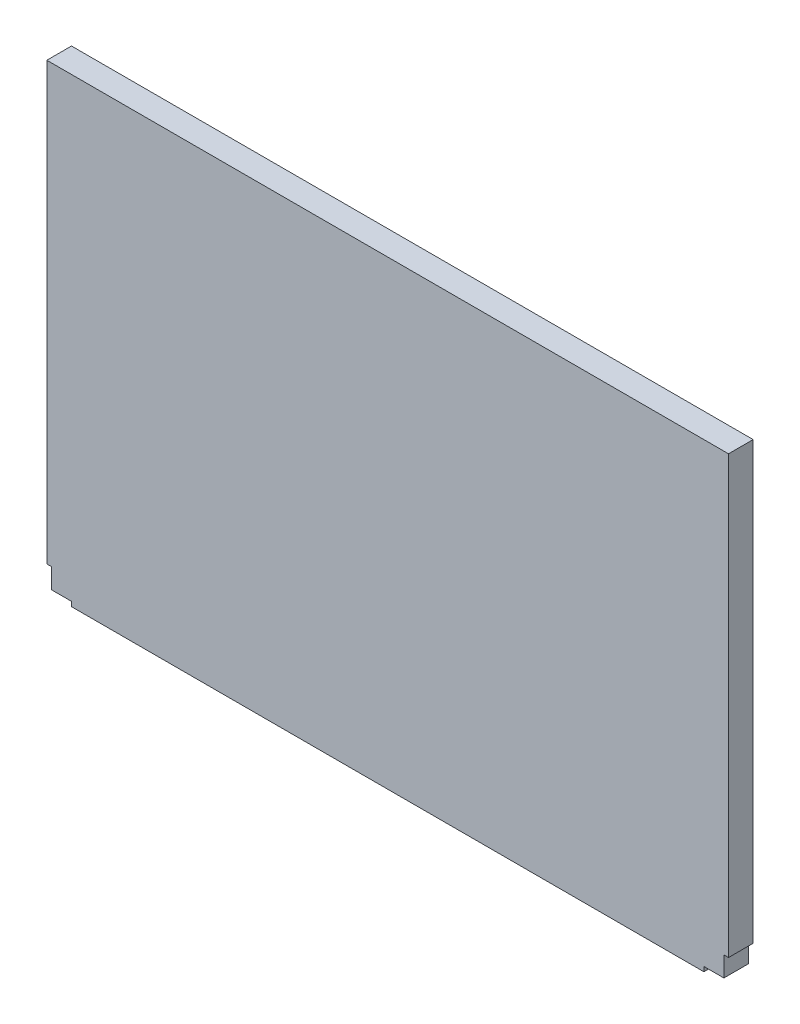
ISO-10303-21;
HEADER;
FILE_DESCRIPTION(('STEP AP214'),'2;1');
FILE_NAME('part.step','',(''),(''),'','','');
FILE_SCHEMA(('AUTOMOTIVE_DESIGN { 1 0 10303 214 1 1 1 1 }'));
ENDSEC;
DATA;
#1=APPLICATION_CONTEXT('core data for automotive mechanical design processes');
#2=APPLICATION_PROTOCOL_DEFINITION('international standard','automotive_design',2000,#1);
#3=PRODUCT_CONTEXT('',#1,'mechanical');
#4=PRODUCT('Part','Part','',(#3));
#5=PRODUCT_RELATED_PRODUCT_CATEGORY('part','',(#4));
#6=PRODUCT_DEFINITION_FORMATION('','',#4);
#7=PRODUCT_DEFINITION_CONTEXT('part definition',#1,'design');
#8=PRODUCT_DEFINITION('design','',#6,#7);
#9=PRODUCT_DEFINITION_SHAPE('','',#8);
#10=(LENGTH_UNIT() NAMED_UNIT(*) SI_UNIT(.MILLI.,.METRE.));
#11=(NAMED_UNIT(*) PLANE_ANGLE_UNIT() SI_UNIT($,.RADIAN.));
#12=(NAMED_UNIT(*) SI_UNIT($,.STERADIAN.) SOLID_ANGLE_UNIT());
#13=UNCERTAINTY_MEASURE_WITH_UNIT(LENGTH_MEASURE(1.E-05),#10,'distance_accuracy_value','');
#14=(GEOMETRIC_REPRESENTATION_CONTEXT(3) GLOBAL_UNCERTAINTY_ASSIGNED_CONTEXT((#13)) GLOBAL_UNIT_ASSIGNED_CONTEXT((#10,
#11,#12)) REPRESENTATION_CONTEXT('',''));
#15=CARTESIAN_POINT('',(0.,0.,0.));
#16=DIRECTION('',(0.,0.,1.));
#17=DIRECTION('',(1.,0.,0.));
#18=AXIS2_PLACEMENT_3D('',#15,#16,#17);
#19=CARTESIAN_POINT('',(0.,0.,50.8));
#20=DIRECTION('',(1.,0.,0.));
#21=DIRECTION('',(0.,1.,0.));
#22=AXIS2_PLACEMENT_3D('',#19,#20,#21);
#23=PLANE('',#22);
#24=DIRECTION('',(0.,-1.,0.));
#25=VECTOR('',#24,1.);
#26=CARTESIAN_POINT('',(0.,0.,0.));
#27=LINE('',#26,#25);
#28=CARTESIAN_POINT('',(0.,0.,0.));
#29=VERTEX_POINT('',#28);
#30=CARTESIAN_POINT('',(0.,-899.2,0.));
#31=VERTEX_POINT('',#30);
#32=EDGE_CURVE('E156',#29,#31,#27,.T.);
#33=ORIENTED_EDGE('',*,*,#32,.T.);
#34=DIRECTION('',(0.,0.,1.));
#35=VECTOR('',#34,1.);
#36=CARTESIAN_POINT('',(0.,-899.2,-0.199999999999999));
#37=LINE('',#36,#35);
#38=CARTESIAN_POINT('',(0.,-899.2,50.8));
#39=VERTEX_POINT('',#38);
#40=EDGE_CURVE('E160',#31,#39,#37,.T.);
#41=ORIENTED_EDGE('',*,*,#40,.T.);
#42=DIRECTION('',(0.,-1.,0.));
#43=VECTOR('',#42,1.);
#44=CARTESIAN_POINT('',(0.,0.,50.8));
#45=LINE('',#44,#43);
#46=CARTESIAN_POINT('',(0.,0.,50.8));
#47=VERTEX_POINT('',#46);
#48=EDGE_CURVE('E152',#47,#39,#45,.T.);
#49=ORIENTED_EDGE('',*,*,#48,.F.);
#50=DIRECTION('',(0.,0.,-1.));
#51=VECTOR('',#50,1.);
#52=CARTESIAN_POINT('',(0.,0.,50.8));
#53=LINE('',#52,#51);
#54=EDGE_CURVE('E149',#47,#29,#53,.T.);
#55=ORIENTED_EDGE('',*,*,#54,.T.);
#56=EDGE_LOOP('',(#33,#41,#49,#55));
#57=FACE_BOUND('',#56,.T.);
#58=ADVANCED_FACE('F35',(#57),#23,.F.);
#59=CARTESIAN_POINT('',(1.16341445918999E-13,-950.,50.8));
#60=DIRECTION('',(0.,1.,0.));
#61=DIRECTION('',(0.,0.,1.));
#62=AXIS2_PLACEMENT_3D('',#59,#60,#61);
#63=PLANE('',#62);
#64=DIRECTION('',(1.,0.,0.));
#65=VECTOR('',#64,1.);
#66=CARTESIAN_POINT('',(1.16341445918999E-13,-950.,0.));
#67=LINE('',#66,#65);
#68=CARTESIAN_POINT('',(50.8000000000001,-950.,0.));
#69=VERTEX_POINT('',#68);
#70=CARTESIAN_POINT('',(1354.2,-950.,0.));
#71=VERTEX_POINT('',#70);
#72=EDGE_CURVE('E159',#69,#71,#67,.T.);
#73=ORIENTED_EDGE('',*,*,#72,.T.);
#74=DIRECTION('',(0.,0.,1.));
#75=VECTOR('',#74,1.);
#76=CARTESIAN_POINT('',(1354.2,-950.,-0.199999999999999));
#77=LINE('',#76,#75);
#78=CARTESIAN_POINT('',(1354.2,-950.,50.8));
#79=VERTEX_POINT('',#78);
#80=EDGE_CURVE('E199',#71,#79,#77,.T.);
#81=ORIENTED_EDGE('',*,*,#80,.T.);
#82=DIRECTION('',(1.,0.,0.));
#83=VECTOR('',#82,1.);
#84=CARTESIAN_POINT('',(1.16341445918999E-13,-950.,50.8));
#85=LINE('',#84,#83);
#86=CARTESIAN_POINT('',(50.8000000000001,-950.,50.8));
#87=VERTEX_POINT('',#86);
#88=EDGE_CURVE('E147',#87,#79,#85,.T.);
#89=ORIENTED_EDGE('',*,*,#88,.F.);
#90=DIRECTION('',(0.,0.,1.));
#91=VECTOR('',#90,1.);
#92=CARTESIAN_POINT('',(50.8000000000001,-950.,-0.199999999999999));
#93=LINE('',#92,#91);
#94=EDGE_CURVE('E214',#69,#87,#93,.T.);
#95=ORIENTED_EDGE('',*,*,#94,.F.);
#96=EDGE_LOOP('',(#73,#81,#89,#95));
#97=FACE_BOUND('',#96,.T.);
#98=ADVANCED_FACE('F244',(#97),#63,.F.);
#99=CARTESIAN_POINT('',(1405.,0.,50.8));
#100=DIRECTION('',(-1.,0.,0.));
#101=DIRECTION('',(0.,-1.,0.));
#102=AXIS2_PLACEMENT_3D('',#99,#100,#101);
#103=PLANE('',#102);
#104=DIRECTION('',(0.,1.,0.));
#105=VECTOR('',#104,1.);
#106=CARTESIAN_POINT('',(1405.,0.,50.8));
#107=LINE('',#106,#105);
#108=CARTESIAN_POINT('',(1405.,-899.2,50.8));
#109=VERTEX_POINT('',#108);
#110=CARTESIAN_POINT('',(1405.,0.,50.8));
#111=VERTEX_POINT('',#110);
#112=EDGE_CURVE('E136',#109,#111,#107,.T.);
#113=ORIENTED_EDGE('',*,*,#112,.F.);
#114=DIRECTION('',(0.,0.,1.));
#115=VECTOR('',#114,1.);
#116=CARTESIAN_POINT('',(1405.,-899.2,-0.199999999999999));
#117=LINE('',#116,#115);
#118=CARTESIAN_POINT('',(1405.,-899.2,0.));
#119=VERTEX_POINT('',#118);
#120=EDGE_CURVE('E121',#119,#109,#117,.T.);
#121=ORIENTED_EDGE('',*,*,#120,.F.);
#122=DIRECTION('',(0.,1.,0.));
#123=VECTOR('',#122,1.);
#124=CARTESIAN_POINT('',(1405.,0.,0.));
#125=LINE('',#124,#123);
#126=CARTESIAN_POINT('',(1405.,0.,0.));
#127=VERTEX_POINT('',#126);
#128=EDGE_CURVE('E163',#119,#127,#125,.T.);
#129=ORIENTED_EDGE('',*,*,#128,.T.);
#130=DIRECTION('',(0.,0.,-1.));
#131=VECTOR('',#130,1.);
#132=CARTESIAN_POINT('',(1405.,0.,50.8));
#133=LINE('',#132,#131);
#134=EDGE_CURVE('E144',#111,#127,#133,.T.);
#135=ORIENTED_EDGE('',*,*,#134,.F.);
#136=EDGE_LOOP('',(#113,#121,#129,#135));
#137=FACE_BOUND('',#136,.T.);
#138=ADVANCED_FACE('F142',(#137),#103,.F.);
#139=CARTESIAN_POINT('',(0.,0.,50.8));
#140=DIRECTION('',(0.,-1.,0.));
#141=DIRECTION('',(0.,0.,-1.));
#142=AXIS2_PLACEMENT_3D('',#139,#140,#141);
#143=PLANE('',#142);
#144=DIRECTION('',(-1.,0.,0.));
#145=VECTOR('',#144,1.);
#146=CARTESIAN_POINT('',(0.,0.,0.));
#147=LINE('',#146,#145);
#148=EDGE_CURVE('E165',#127,#29,#147,.T.);
#149=ORIENTED_EDGE('',*,*,#148,.T.);
#150=ORIENTED_EDGE('',*,*,#54,.F.);
#151=DIRECTION('',(-1.,0.,0.));
#152=VECTOR('',#151,1.);
#153=CARTESIAN_POINT('',(0.,0.,50.8));
#154=LINE('',#153,#152);
#155=EDGE_CURVE('E146',#111,#47,#154,.T.);
#156=ORIENTED_EDGE('',*,*,#155,.F.);
#157=ORIENTED_EDGE('',*,*,#134,.T.);
#158=EDGE_LOOP('',(#149,#150,#156,#157));
#159=FACE_BOUND('',#158,.T.);
#160=ADVANCED_FACE('F267',(#159),#143,.F.);
#161=CARTESIAN_POINT('',(0.,0.,50.8));
#162=DIRECTION('',(0.,0.,1.));
#163=DIRECTION('',(1.,0.,0.));
#164=AXIS2_PLACEMENT_3D('',#161,#162,#163);
#165=PLANE('',#164);
#166=DIRECTION('',(0.,-1.,0.));
#167=VECTOR('',#166,1.);
#168=CARTESIAN_POINT('',(1354.2,-940.475,50.8));
#169=LINE('',#168,#167);
#170=CARTESIAN_POINT('',(1354.2,-940.475,50.8));
#171=VERTEX_POINT('',#170);
#172=EDGE_CURVE('E131',#171,#79,#169,.T.);
#173=ORIENTED_EDGE('',*,*,#172,.F.);
#174=DIRECTION('',(-1.,0.,0.));
#175=VECTOR('',#174,1.);
#176=CARTESIAN_POINT('',(1395.475,-940.475,50.8));
#177=LINE('',#176,#175);
#178=CARTESIAN_POINT('',(1395.475,-940.475,50.8));
#179=VERTEX_POINT('',#178);
#180=EDGE_CURVE('E248',#179,#171,#177,.T.);
#181=ORIENTED_EDGE('',*,*,#180,.F.);
#182=DIRECTION('',(0.,-1.,0.));
#183=VECTOR('',#182,1.);
#184=CARTESIAN_POINT('',(1395.475,-899.2,50.8));
#185=LINE('',#184,#183);
#186=CARTESIAN_POINT('',(1395.475,-899.2,50.8));
#187=VERTEX_POINT('',#186);
#188=EDGE_CURVE('E140',#187,#179,#185,.T.);
#189=ORIENTED_EDGE('',*,*,#188,.F.);
#190=DIRECTION('',(-1.,0.,0.));
#191=VECTOR('',#190,1.);
#192=CARTESIAN_POINT('',(1405.,-899.2,50.8));
#193=LINE('',#192,#191);
#194=EDGE_CURVE('E124',#109,#187,#193,.T.);
#195=ORIENTED_EDGE('',*,*,#194,.F.);
#196=ORIENTED_EDGE('',*,*,#112,.T.);
#197=ORIENTED_EDGE('',*,*,#155,.T.);
#198=ORIENTED_EDGE('',*,*,#48,.T.);
#199=DIRECTION('',(-1.,0.,0.));
#200=VECTOR('',#199,1.);
#201=CARTESIAN_POINT('',(0.,-899.2,50.8));
#202=LINE('',#201,#200);
#203=CARTESIAN_POINT('',(9.525,-899.2,50.8));
#204=VERTEX_POINT('',#203);
#205=EDGE_CURVE('E212',#204,#39,#202,.T.);
#206=ORIENTED_EDGE('',*,*,#205,.F.);
#207=DIRECTION('',(0.,1.,0.));
#208=VECTOR('',#207,1.);
#209=CARTESIAN_POINT('',(9.525,-899.2,50.8));
#210=LINE('',#209,#208);
#211=CARTESIAN_POINT('',(9.52500000000001,-940.475,50.8));
#212=VERTEX_POINT('',#211);
#213=EDGE_CURVE('E209',#212,#204,#210,.T.);
#214=ORIENTED_EDGE('',*,*,#213,.F.);
#215=DIRECTION('',(-1.,0.,0.));
#216=VECTOR('',#215,1.);
#217=CARTESIAN_POINT('',(9.52500000000001,-940.475,50.8));
#218=LINE('',#217,#216);
#219=CARTESIAN_POINT('',(50.8000000000001,-940.475,50.8));
#220=VERTEX_POINT('',#219);
#221=EDGE_CURVE('E206',#220,#212,#218,.T.);
#222=ORIENTED_EDGE('',*,*,#221,.F.);
#223=DIRECTION('',(0.,1.,0.));
#224=VECTOR('',#223,1.);
#225=CARTESIAN_POINT('',(50.8000000000001,-940.475,50.8));
#226=LINE('',#225,#224);
#227=EDGE_CURVE('E204',#87,#220,#226,.T.);
#228=ORIENTED_EDGE('',*,*,#227,.F.);
#229=ORIENTED_EDGE('',*,*,#88,.T.);
#230=EDGE_LOOP('',(#173,#181,#189,#195,#196,#197,#198,#206,#214,#222,#228,#229));
#231=FACE_BOUND('',#230,.T.);
#232=ADVANCED_FACE('F135',(#231),#165,.T.);
#233=CARTESIAN_POINT('',(0.,0.,0.));
#234=DIRECTION('',(0.,0.,1.));
#235=DIRECTION('',(1.,0.,0.));
#236=AXIS2_PLACEMENT_3D('',#233,#234,#235);
#237=PLANE('',#236);
#238=DIRECTION('',(-1.,0.,0.));
#239=VECTOR('',#238,1.);
#240=CARTESIAN_POINT('',(0.,-940.475,0.));
#241=LINE('',#240,#239);
#242=CARTESIAN_POINT('',(1395.475,-940.475,0.));
#243=VERTEX_POINT('',#242);
#244=CARTESIAN_POINT('',(1354.2,-940.475,0.));
#245=VERTEX_POINT('',#244);
#246=EDGE_CURVE('E42',#243,#245,#241,.T.);
#247=ORIENTED_EDGE('',*,*,#246,.T.);
#248=DIRECTION('',(0.,-1.,0.));
#249=VECTOR('',#248,1.);
#250=CARTESIAN_POINT('',(1354.2,0.,0.));
#251=LINE('',#250,#249);
#252=EDGE_CURVE('E11',#245,#71,#251,.T.);
#253=ORIENTED_EDGE('',*,*,#252,.T.);
#254=ORIENTED_EDGE('',*,*,#72,.F.);
#255=DIRECTION('',(0.,1.,0.));
#256=VECTOR('',#255,1.);
#257=CARTESIAN_POINT('',(50.7999999999994,0.,0.));
#258=LINE('',#257,#256);
#259=CARTESIAN_POINT('',(50.8000000000001,-940.475,0.));
#260=VERTEX_POINT('',#259);
#261=EDGE_CURVE('E170',#69,#260,#258,.T.);
#262=ORIENTED_EDGE('',*,*,#261,.T.);
#263=DIRECTION('',(-1.,0.,0.));
#264=VECTOR('',#263,1.);
#265=CARTESIAN_POINT('',(0.,-940.475,0.));
#266=LINE('',#265,#264);
#267=CARTESIAN_POINT('',(9.52500000000001,-940.475,0.));
#268=VERTEX_POINT('',#267);
#269=EDGE_CURVE('E173',#260,#268,#266,.T.);
#270=ORIENTED_EDGE('',*,*,#269,.T.);
#271=DIRECTION('',(0.,1.,0.));
#272=VECTOR('',#271,1.);
#273=CARTESIAN_POINT('',(9.52499999999989,0.,0.));
#274=LINE('',#273,#272);
#275=CARTESIAN_POINT('',(9.525,-899.2,0.));
#276=VERTEX_POINT('',#275);
#277=EDGE_CURVE('E176',#268,#276,#274,.T.);
#278=ORIENTED_EDGE('',*,*,#277,.T.);
#279=DIRECTION('',(-1.,0.,0.));
#280=VECTOR('',#279,1.);
#281=CARTESIAN_POINT('',(0.,-899.2,0.));
#282=LINE('',#281,#280);
#283=EDGE_CURVE('E179',#276,#31,#282,.T.);
#284=ORIENTED_EDGE('',*,*,#283,.T.);
#285=ORIENTED_EDGE('',*,*,#32,.F.);
#286=ORIENTED_EDGE('',*,*,#148,.F.);
#287=ORIENTED_EDGE('',*,*,#128,.F.);
#288=DIRECTION('',(-1.,0.,0.));
#289=VECTOR('',#288,1.);
#290=CARTESIAN_POINT('',(0.,-899.2,0.));
#291=LINE('',#290,#289);
#292=CARTESIAN_POINT('',(1395.475,-899.2,0.));
#293=VERTEX_POINT('',#292);
#294=EDGE_CURVE('E127',#119,#293,#291,.T.);
#295=ORIENTED_EDGE('',*,*,#294,.T.);
#296=DIRECTION('',(0.,-1.,0.));
#297=VECTOR('',#296,1.);
#298=CARTESIAN_POINT('',(1395.475,0.,0.));
#299=LINE('',#298,#297);
#300=EDGE_CURVE('E183',#293,#243,#299,.T.);
#301=ORIENTED_EDGE('',*,*,#300,.T.);
#302=EDGE_LOOP('',(#247,#253,#254,#262,#270,#278,#284,#285,#286,#287,#295,#301));
#303=FACE_BOUND('',#302,.T.);
#304=ADVANCED_FACE('F187',(#303),#237,.F.);
#305=CARTESIAN_POINT('',(0.,-899.2,-0.199999999999999));
#306=DIRECTION('',(0.,1.,0.));
#307=DIRECTION('',(0.,0.,1.));
#308=AXIS2_PLACEMENT_3D('',#305,#306,#307);
#309=PLANE('',#308);
#310=DIRECTION('',(0.,0.,1.));
#311=VECTOR('',#310,1.);
#312=CARTESIAN_POINT('',(9.525,-899.2,-0.199999999999999));
#313=LINE('',#312,#311);
#314=EDGE_CURVE('E217',#276,#204,#313,.T.);
#315=ORIENTED_EDGE('',*,*,#314,.T.);
#316=ORIENTED_EDGE('',*,*,#205,.T.);
#317=ORIENTED_EDGE('',*,*,#40,.F.);
#318=ORIENTED_EDGE('',*,*,#283,.F.);
#319=EDGE_LOOP('',(#315,#316,#317,#318));
#320=FACE_BOUND('',#319,.T.);
#321=ADVANCED_FACE('F230',(#320),#309,.F.);
#322=CARTESIAN_POINT('',(9.525,-899.2,-0.199999999999999));
#323=DIRECTION('',(1.,0.,0.));
#324=DIRECTION('',(0.,1.,0.));
#325=AXIS2_PLACEMENT_3D('',#322,#323,#324);
#326=PLANE('',#325);
#327=DIRECTION('',(0.,0.,1.));
#328=VECTOR('',#327,1.);
#329=CARTESIAN_POINT('',(9.52500000000001,-940.475,-0.199999999999999));
#330=LINE('',#329,#328);
#331=EDGE_CURVE('E219',#268,#212,#330,.T.);
#332=ORIENTED_EDGE('',*,*,#331,.T.);
#333=ORIENTED_EDGE('',*,*,#213,.T.);
#334=ORIENTED_EDGE('',*,*,#314,.F.);
#335=ORIENTED_EDGE('',*,*,#277,.F.);
#336=EDGE_LOOP('',(#332,#333,#334,#335));
#337=FACE_BOUND('',#336,.T.);
#338=ADVANCED_FACE('F235',(#337),#326,.F.);
#339=CARTESIAN_POINT('',(9.52500000000001,-940.475,-0.199999999999999));
#340=DIRECTION('',(0.,1.,0.));
#341=DIRECTION('',(0.,0.,1.));
#342=AXIS2_PLACEMENT_3D('',#339,#340,#341);
#343=PLANE('',#342);
#344=DIRECTION('',(0.,0.,1.));
#345=VECTOR('',#344,1.);
#346=CARTESIAN_POINT('',(50.8000000000001,-940.475,-0.199999999999999));
#347=LINE('',#346,#345);
#348=EDGE_CURVE('E57',#260,#220,#347,.T.);
#349=ORIENTED_EDGE('',*,*,#348,.T.);
#350=ORIENTED_EDGE('',*,*,#221,.T.);
#351=ORIENTED_EDGE('',*,*,#331,.F.);
#352=ORIENTED_EDGE('',*,*,#269,.F.);
#353=EDGE_LOOP('',(#349,#350,#351,#352));
#354=FACE_BOUND('',#353,.T.);
#355=ADVANCED_FACE('F237',(#354),#343,.F.);
#356=CARTESIAN_POINT('',(50.8000000000001,-940.475,-0.199999999999999));
#357=DIRECTION('',(1.,0.,0.));
#358=DIRECTION('',(0.,1.,0.));
#359=AXIS2_PLACEMENT_3D('',#356,#357,#358);
#360=PLANE('',#359);
#361=ORIENTED_EDGE('',*,*,#94,.T.);
#362=ORIENTED_EDGE('',*,*,#227,.T.);
#363=ORIENTED_EDGE('',*,*,#348,.F.);
#364=ORIENTED_EDGE('',*,*,#261,.F.);
#365=EDGE_LOOP('',(#361,#362,#363,#364));
#366=FACE_BOUND('',#365,.T.);
#367=ADVANCED_FACE('F252',(#366),#360,.F.);
#368=CARTESIAN_POINT('',(1354.2,-940.475,-0.199999999999999));
#369=DIRECTION('',(-1.,0.,0.));
#370=DIRECTION('',(0.,0.,1.));
#371=AXIS2_PLACEMENT_3D('',#368,#369,#370);
#372=PLANE('',#371);
#373=DIRECTION('',(0.,0.,1.));
#374=VECTOR('',#373,1.);
#375=CARTESIAN_POINT('',(1354.2,-940.475,-0.199999999999999));
#376=LINE('',#375,#374);
#377=EDGE_CURVE('E195',#245,#171,#376,.T.);
#378=ORIENTED_EDGE('',*,*,#377,.T.);
#379=ORIENTED_EDGE('',*,*,#172,.T.);
#380=ORIENTED_EDGE('',*,*,#80,.F.);
#381=ORIENTED_EDGE('',*,*,#252,.F.);
#382=EDGE_LOOP('',(#378,#379,#380,#381));
#383=FACE_BOUND('',#382,.T.);
#384=ADVANCED_FACE('F250',(#383),#372,.F.);
#385=CARTESIAN_POINT('',(1395.475,-940.475,-0.199999999999999));
#386=DIRECTION('',(0.,1.,0.));
#387=DIRECTION('',(0.,0.,1.));
#388=AXIS2_PLACEMENT_3D('',#385,#386,#387);
#389=PLANE('',#388);
#390=DIRECTION('',(0.,0.,1.));
#391=VECTOR('',#390,1.);
#392=CARTESIAN_POINT('',(1395.475,-940.475,-0.199999999999999));
#393=LINE('',#392,#391);
#394=EDGE_CURVE('E194',#243,#179,#393,.T.);
#395=ORIENTED_EDGE('',*,*,#394,.T.);
#396=ORIENTED_EDGE('',*,*,#180,.T.);
#397=ORIENTED_EDGE('',*,*,#377,.F.);
#398=ORIENTED_EDGE('',*,*,#246,.F.);
#399=EDGE_LOOP('',(#395,#396,#397,#398));
#400=FACE_BOUND('',#399,.T.);
#401=ADVANCED_FACE('F192',(#400),#389,.F.);
#402=CARTESIAN_POINT('',(1395.475,-899.2,-0.199999999999999));
#403=DIRECTION('',(-1.,0.,0.));
#404=DIRECTION('',(0.,0.,1.));
#405=AXIS2_PLACEMENT_3D('',#402,#403,#404);
#406=PLANE('',#405);
#407=DIRECTION('',(0.,0.,1.));
#408=VECTOR('',#407,1.);
#409=CARTESIAN_POINT('',(1395.475,-899.2,-0.199999999999999));
#410=LINE('',#409,#408);
#411=EDGE_CURVE('E49',#293,#187,#410,.T.);
#412=ORIENTED_EDGE('',*,*,#411,.T.);
#413=ORIENTED_EDGE('',*,*,#188,.T.);
#414=ORIENTED_EDGE('',*,*,#394,.F.);
#415=ORIENTED_EDGE('',*,*,#300,.F.);
#416=EDGE_LOOP('',(#412,#413,#414,#415));
#417=FACE_BOUND('',#416,.T.);
#418=ADVANCED_FACE('F197',(#417),#406,.F.);
#419=CARTESIAN_POINT('',(1405.,-899.2,-0.199999999999999));
#420=DIRECTION('',(0.,1.,0.));
#421=DIRECTION('',(0.,0.,1.));
#422=AXIS2_PLACEMENT_3D('',#419,#420,#421);
#423=PLANE('',#422);
#424=ORIENTED_EDGE('',*,*,#120,.T.);
#425=ORIENTED_EDGE('',*,*,#194,.T.);
#426=ORIENTED_EDGE('',*,*,#411,.F.);
#427=ORIENTED_EDGE('',*,*,#294,.F.);
#428=EDGE_LOOP('',(#424,#425,#426,#427));
#429=FACE_BOUND('',#428,.T.);
#430=ADVANCED_FACE('F123',(#429),#423,.F.);
#431=CLOSED_SHELL('',(#58,#98,#138,#160,#232,#304,#321,#338,#355,#367,#384,#401,#418,#430));
#432=MANIFOLD_SOLID_BREP('B2',#431);
#433=ADVANCED_BREP_SHAPE_REPRESENTATION('',(#18,#432),#14);
#434=SHAPE_DEFINITION_REPRESENTATION(#9,#433);
ENDSEC;
END-ISO-10303-21;
